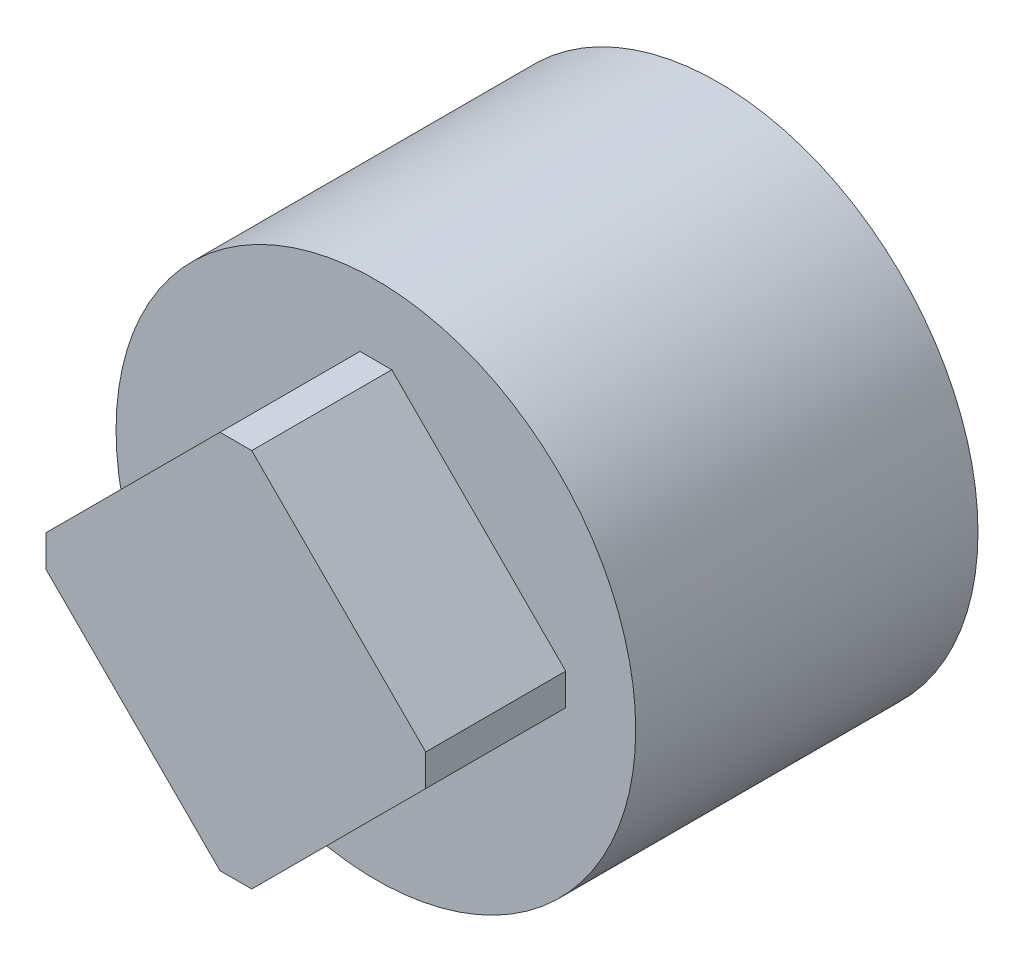
ISO-10303-21;
HEADER;
FILE_DESCRIPTION(('STEP AP214'),'2;1');
FILE_NAME('part.step','',(''),(''),'','','');
FILE_SCHEMA(('AUTOMOTIVE_DESIGN { 1 0 10303 214 1 1 1 1 }'));
ENDSEC;
DATA;
#1=APPLICATION_CONTEXT('core data for automotive mechanical design processes');
#2=APPLICATION_PROTOCOL_DEFINITION('international standard','automotive_design',2000,#1);
#3=PRODUCT_CONTEXT('',#1,'mechanical');
#4=PRODUCT('Part','Part','',(#3));
#5=PRODUCT_RELATED_PRODUCT_CATEGORY('part','',(#4));
#6=PRODUCT_DEFINITION_FORMATION('','',#4);
#7=PRODUCT_DEFINITION_CONTEXT('part definition',#1,'design');
#8=PRODUCT_DEFINITION('design','',#6,#7);
#9=PRODUCT_DEFINITION_SHAPE('','',#8);
#10=(LENGTH_UNIT() NAMED_UNIT(*) SI_UNIT(.MILLI.,.METRE.));
#11=(NAMED_UNIT(*) PLANE_ANGLE_UNIT() SI_UNIT($,.RADIAN.));
#12=(NAMED_UNIT(*) SI_UNIT($,.STERADIAN.) SOLID_ANGLE_UNIT());
#13=UNCERTAINTY_MEASURE_WITH_UNIT(LENGTH_MEASURE(1.E-05),#10,'distance_accuracy_value','');
#14=(GEOMETRIC_REPRESENTATION_CONTEXT(3) GLOBAL_UNCERTAINTY_ASSIGNED_CONTEXT((#13)) GLOBAL_UNIT_ASSIGNED_CONTEXT((#10,
#11,#12)) REPRESENTATION_CONTEXT('',''));
#15=CARTESIAN_POINT('',(0.,0.,0.));
#16=DIRECTION('',(0.,0.,1.));
#17=DIRECTION('',(1.,0.,0.));
#18=AXIS2_PLACEMENT_3D('',#15,#16,#17);
#19=CARTESIAN_POINT('',(0.,0.,1.));
#20=DIRECTION('',(0.,0.,1.));
#21=DIRECTION('',(1.,0.,0.));
#22=AXIS2_PLACEMENT_3D('',#19,#20,#21);
#23=PLANE('',#22);
#24=CARTESIAN_POINT('',(0.,0.,1.));
#25=DIRECTION('',(0.,0.,1.));
#26=DIRECTION('',(1.,0.,0.));
#27=AXIS2_PLACEMENT_3D('',#24,#25,#26);
#28=CIRCLE('',#27,10.2);
#29=CARTESIAN_POINT('',(10.2,0.,1.));
#30=VERTEX_POINT('',#29);
#31=EDGE_CURVE('E486',#30,#30,#28,.T.);
#32=ORIENTED_EDGE('',*,*,#31,.T.);
#33=EDGE_LOOP('',(#32));
#34=FACE_BOUND('',#33,.T.);
#35=CARTESIAN_POINT('',(0.,0.,1.));
#36=DIRECTION('',(0.,0.,1.));
#37=DIRECTION('',(1.,0.,0.));
#38=AXIS2_PLACEMENT_3D('',#35,#36,#37);
#39=CIRCLE('',#38,16.7);
#40=CARTESIAN_POINT('',(16.7,0.,1.));
#41=VERTEX_POINT('',#40);
#42=EDGE_CURVE('E259',#41,#41,#39,.T.);
#43=ORIENTED_EDGE('',*,*,#42,.F.);
#44=EDGE_LOOP('',(#43));
#45=FACE_BOUND('',#44,.T.);
#46=ADVANCED_FACE('F39',(#34,#45),#23,.F.);
#47=CARTESIAN_POINT('',(0.,0.,23.));
#48=DIRECTION('',(0.,0.,-1.));
#49=DIRECTION('',(-1.,0.,0.));
#50=AXIS2_PLACEMENT_3D('',#47,#48,#49);
#51=CYLINDRICAL_SURFACE('',#50,16.7);
#52=CARTESIAN_POINT('',(0.,0.,23.));
#53=DIRECTION('',(0.,0.,1.));
#54=DIRECTION('',(1.,0.,0.));
#55=AXIS2_PLACEMENT_3D('',#52,#53,#54);
#56=CIRCLE('',#55,16.7);
#57=CARTESIAN_POINT('',(16.7,0.,23.));
#58=VERTEX_POINT('',#57);
#59=EDGE_CURVE('E50',#58,#58,#56,.T.);
#60=ORIENTED_EDGE('',*,*,#59,.F.);
#61=EDGE_LOOP('',(#60));
#62=FACE_BOUND('',#61,.T.);
#63=ORIENTED_EDGE('',*,*,#42,.T.);
#64=EDGE_LOOP('',(#63));
#65=FACE_BOUND('',#64,.T.);
#66=ADVANCED_FACE('F41',(#62,#65),#51,.T.);
#67=CARTESIAN_POINT('',(0.,0.,23.));
#68=DIRECTION('',(0.,0.,1.));
#69=DIRECTION('',(1.,0.,0.));
#70=AXIS2_PLACEMENT_3D('',#67,#68,#69);
#71=PLANE('',#70);
#72=DIRECTION('',(-0.707106781186548,0.707106781186548,0.));
#73=VECTOR('',#72,1.);
#74=CARTESIAN_POINT('',(12.2028968081884,1.02,23.));
#75=LINE('',#74,#73);
#76=CARTESIAN_POINT('',(12.2028968081884,1.02,23.));
#77=VERTEX_POINT('',#76);
#78=CARTESIAN_POINT('',(1.02,12.2028968081884,23.));
#79=VERTEX_POINT('',#78);
#80=EDGE_CURVE('E62',#77,#79,#75,.T.);
#81=ORIENTED_EDGE('',*,*,#80,.F.);
#82=DIRECTION('',(0.,1.,0.));
#83=VECTOR('',#82,1.);
#84=CARTESIAN_POINT('',(12.2028968081884,-1.02,23.));
#85=LINE('',#84,#83);
#86=CARTESIAN_POINT('',(12.2028968081884,-1.02,23.));
#87=VERTEX_POINT('',#86);
#88=EDGE_CURVE('E197',#87,#77,#85,.T.);
#89=ORIENTED_EDGE('',*,*,#88,.F.);
#90=DIRECTION('',(0.707106781186548,0.707106781186548,0.));
#91=VECTOR('',#90,1.);
#92=CARTESIAN_POINT('',(1.02,-12.2028968081884,23.));
#93=LINE('',#92,#91);
#94=CARTESIAN_POINT('',(1.02,-12.2028968081884,23.));
#95=VERTEX_POINT('',#94);
#96=EDGE_CURVE('E229',#95,#87,#93,.T.);
#97=ORIENTED_EDGE('',*,*,#96,.F.);
#98=DIRECTION('',(1.,0.,0.));
#99=VECTOR('',#98,1.);
#100=CARTESIAN_POINT('',(-1.02,-12.2028968081884,23.));
#101=LINE('',#100,#99);
#102=CARTESIAN_POINT('',(-1.02,-12.2028968081884,23.));
#103=VERTEX_POINT('',#102);
#104=EDGE_CURVE('E227',#103,#95,#101,.T.);
#105=ORIENTED_EDGE('',*,*,#104,.F.);
#106=DIRECTION('',(0.707106781186548,-0.707106781186548,0.));
#107=VECTOR('',#106,1.);
#108=CARTESIAN_POINT('',(-12.2028968081884,-1.02,23.));
#109=LINE('',#108,#107);
#110=CARTESIAN_POINT('',(-12.2028968081884,-1.02,23.));
#111=VERTEX_POINT('',#110);
#112=EDGE_CURVE('E225',#111,#103,#109,.T.);
#113=ORIENTED_EDGE('',*,*,#112,.F.);
#114=DIRECTION('',(0.,-1.,0.));
#115=VECTOR('',#114,1.);
#116=CARTESIAN_POINT('',(-12.2028968081884,1.02,23.));
#117=LINE('',#116,#115);
#118=CARTESIAN_POINT('',(-12.2028968081884,1.02,23.));
#119=VERTEX_POINT('',#118);
#120=EDGE_CURVE('E223',#119,#111,#117,.T.);
#121=ORIENTED_EDGE('',*,*,#120,.F.);
#122=DIRECTION('',(-0.707106781186548,-0.707106781186548,0.));
#123=VECTOR('',#122,1.);
#124=CARTESIAN_POINT('',(-1.02,12.2028968081884,23.));
#125=LINE('',#124,#123);
#126=CARTESIAN_POINT('',(-1.02,12.2028968081884,23.));
#127=VERTEX_POINT('',#126);
#128=EDGE_CURVE('E216',#127,#119,#125,.T.);
#129=ORIENTED_EDGE('',*,*,#128,.F.);
#130=DIRECTION('',(-1.,0.,0.));
#131=VECTOR('',#130,1.);
#132=CARTESIAN_POINT('',(1.02,12.2028968081884,23.));
#133=LINE('',#132,#131);
#134=EDGE_CURVE('E213',#79,#127,#133,.T.);
#135=ORIENTED_EDGE('',*,*,#134,.F.);
#136=EDGE_LOOP('',(#81,#89,#97,#105,#113,#121,#129,#135));
#137=FACE_BOUND('',#136,.T.);
#138=ORIENTED_EDGE('',*,*,#59,.T.);
#139=EDGE_LOOP('',(#138));
#140=FACE_BOUND('',#139,.T.);
#141=ADVANCED_FACE('F266',(#137,#140),#71,.T.);
#142=CARTESIAN_POINT('',(12.2028968081884,1.02,32.));
#143=DIRECTION('',(-0.707106781186547,-0.707106781186547,0.));
#144=DIRECTION('',(0.707106781186548,-0.707106781186548,0.));
#145=AXIS2_PLACEMENT_3D('',#142,#143,#144);
#146=PLANE('',#145);
#147=ORIENTED_EDGE('',*,*,#80,.T.);
#148=DIRECTION('',(0.,0.,-1.));
#149=VECTOR('',#148,1.);
#150=CARTESIAN_POINT('',(1.02,12.2028968081884,32.));
#151=LINE('',#150,#149);
#152=CARTESIAN_POINT('',(1.02,12.2028968081884,32.));
#153=VERTEX_POINT('',#152);
#154=EDGE_CURVE('E251',#153,#79,#151,.T.);
#155=ORIENTED_EDGE('',*,*,#154,.F.);
#156=DIRECTION('',(-0.707106781186548,0.707106781186548,0.));
#157=VECTOR('',#156,1.);
#158=CARTESIAN_POINT('',(12.2028968081884,1.02,32.));
#159=LINE('',#158,#157);
#160=CARTESIAN_POINT('',(12.2028968081884,1.02,32.));
#161=VERTEX_POINT('',#160);
#162=EDGE_CURVE('E193',#161,#153,#159,.T.);
#163=ORIENTED_EDGE('',*,*,#162,.F.);
#164=DIRECTION('',(0.,0.,-1.));
#165=VECTOR('',#164,1.);
#166=CARTESIAN_POINT('',(12.2028968081884,1.02,32.));
#167=LINE('',#166,#165);
#168=EDGE_CURVE('E215',#161,#77,#167,.T.);
#169=ORIENTED_EDGE('',*,*,#168,.T.);
#170=EDGE_LOOP('',(#147,#155,#163,#169));
#171=FACE_BOUND('',#170,.T.);
#172=ADVANCED_FACE('F277',(#171),#146,.F.);
#173=CARTESIAN_POINT('',(1.02,12.2028968081884,32.));
#174=DIRECTION('',(0.,-1.,0.));
#175=DIRECTION('',(0.,0.,-1.));
#176=AXIS2_PLACEMENT_3D('',#173,#174,#175);
#177=PLANE('',#176);
#178=ORIENTED_EDGE('',*,*,#134,.T.);
#179=DIRECTION('',(0.,0.,-1.));
#180=VECTOR('',#179,1.);
#181=CARTESIAN_POINT('',(-1.02,12.2028968081884,32.));
#182=LINE('',#181,#180);
#183=CARTESIAN_POINT('',(-1.02,12.2028968081884,32.));
#184=VERTEX_POINT('',#183);
#185=EDGE_CURVE('E252',#184,#127,#182,.T.);
#186=ORIENTED_EDGE('',*,*,#185,.F.);
#187=DIRECTION('',(-1.,0.,0.));
#188=VECTOR('',#187,1.);
#189=CARTESIAN_POINT('',(1.02,12.2028968081884,32.));
#190=LINE('',#189,#188);
#191=EDGE_CURVE('E196',#153,#184,#190,.T.);
#192=ORIENTED_EDGE('',*,*,#191,.F.);
#193=ORIENTED_EDGE('',*,*,#154,.T.);
#194=EDGE_LOOP('',(#178,#186,#192,#193));
#195=FACE_BOUND('',#194,.T.);
#196=ADVANCED_FACE('F276',(#195),#177,.F.);
#197=CARTESIAN_POINT('',(-1.02,12.2028968081884,32.));
#198=DIRECTION('',(0.707106781186547,-0.707106781186547,0.));
#199=DIRECTION('',(0.707106781186548,0.707106781186548,0.));
#200=AXIS2_PLACEMENT_3D('',#197,#198,#199);
#201=PLANE('',#200);
#202=ORIENTED_EDGE('',*,*,#128,.T.);
#203=DIRECTION('',(0.,0.,-1.));
#204=VECTOR('',#203,1.);
#205=CARTESIAN_POINT('',(-12.2028968081884,1.02,32.));
#206=LINE('',#205,#204);
#207=CARTESIAN_POINT('',(-12.2028968081884,1.02,32.));
#208=VERTEX_POINT('',#207);
#209=EDGE_CURVE('E247',#208,#119,#206,.T.);
#210=ORIENTED_EDGE('',*,*,#209,.F.);
#211=DIRECTION('',(-0.707106781186548,-0.707106781186548,0.));
#212=VECTOR('',#211,1.);
#213=CARTESIAN_POINT('',(-1.02,12.2028968081884,32.));
#214=LINE('',#213,#212);
#215=EDGE_CURVE('E203',#184,#208,#214,.T.);
#216=ORIENTED_EDGE('',*,*,#215,.F.);
#217=ORIENTED_EDGE('',*,*,#185,.T.);
#218=EDGE_LOOP('',(#202,#210,#216,#217));
#219=FACE_BOUND('',#218,.T.);
#220=ADVANCED_FACE('F281',(#219),#201,.F.);
#221=CARTESIAN_POINT('',(-12.2028968081884,1.02,32.));
#222=DIRECTION('',(1.,0.,0.));
#223=DIRECTION('',(0.,0.,-1.));
#224=AXIS2_PLACEMENT_3D('',#221,#222,#223);
#225=PLANE('',#224);
#226=ORIENTED_EDGE('',*,*,#120,.T.);
#227=DIRECTION('',(0.,0.,-1.));
#228=VECTOR('',#227,1.);
#229=CARTESIAN_POINT('',(-12.2028968081884,-1.02,32.));
#230=LINE('',#229,#228);
#231=CARTESIAN_POINT('',(-12.2028968081884,-1.02,32.));
#232=VERTEX_POINT('',#231);
#233=EDGE_CURVE('E244',#232,#111,#230,.T.);
#234=ORIENTED_EDGE('',*,*,#233,.F.);
#235=DIRECTION('',(0.,-1.,0.));
#236=VECTOR('',#235,1.);
#237=CARTESIAN_POINT('',(-12.2028968081884,1.02,32.));
#238=LINE('',#237,#236);
#239=EDGE_CURVE('E202',#208,#232,#238,.T.);
#240=ORIENTED_EDGE('',*,*,#239,.F.);
#241=ORIENTED_EDGE('',*,*,#209,.T.);
#242=EDGE_LOOP('',(#226,#234,#240,#241));
#243=FACE_BOUND('',#242,.T.);
#244=ADVANCED_FACE('F289',(#243),#225,.F.);
#245=CARTESIAN_POINT('',(-12.2028968081884,-1.02,32.));
#246=DIRECTION('',(0.707106781186547,0.707106781186547,0.));
#247=DIRECTION('',(-0.707106781186548,0.707106781186548,0.));
#248=AXIS2_PLACEMENT_3D('',#245,#246,#247);
#249=PLANE('',#248);
#250=ORIENTED_EDGE('',*,*,#112,.T.);
#251=DIRECTION('',(0.,0.,-1.));
#252=VECTOR('',#251,1.);
#253=CARTESIAN_POINT('',(-1.02,-12.2028968081884,32.));
#254=LINE('',#253,#252);
#255=CARTESIAN_POINT('',(-1.02,-12.2028968081884,32.));
#256=VERTEX_POINT('',#255);
#257=EDGE_CURVE('E245',#256,#103,#254,.T.);
#258=ORIENTED_EDGE('',*,*,#257,.F.);
#259=DIRECTION('',(0.707106781186548,-0.707106781186548,0.));
#260=VECTOR('',#259,1.);
#261=CARTESIAN_POINT('',(-12.2028968081884,-1.02,32.));
#262=LINE('',#261,#260);
#263=EDGE_CURVE('E201',#232,#256,#262,.T.);
#264=ORIENTED_EDGE('',*,*,#263,.F.);
#265=ORIENTED_EDGE('',*,*,#233,.T.);
#266=EDGE_LOOP('',(#250,#258,#264,#265));
#267=FACE_BOUND('',#266,.T.);
#268=ADVANCED_FACE('F293',(#267),#249,.F.);
#269=CARTESIAN_POINT('',(-1.02,-12.2028968081884,32.));
#270=DIRECTION('',(0.,1.,0.));
#271=DIRECTION('',(0.,0.,1.));
#272=AXIS2_PLACEMENT_3D('',#269,#270,#271);
#273=PLANE('',#272);
#274=ORIENTED_EDGE('',*,*,#104,.T.);
#275=DIRECTION('',(0.,0.,-1.));
#276=VECTOR('',#275,1.);
#277=CARTESIAN_POINT('',(1.02,-12.2028968081884,32.));
#278=LINE('',#277,#276);
#279=CARTESIAN_POINT('',(1.02,-12.2028968081884,32.));
#280=VERTEX_POINT('',#279);
#281=EDGE_CURVE('E237',#280,#95,#278,.T.);
#282=ORIENTED_EDGE('',*,*,#281,.F.);
#283=DIRECTION('',(1.,0.,0.));
#284=VECTOR('',#283,1.);
#285=CARTESIAN_POINT('',(-1.02,-12.2028968081884,32.));
#286=LINE('',#285,#284);
#287=EDGE_CURVE('E210',#256,#280,#286,.T.);
#288=ORIENTED_EDGE('',*,*,#287,.F.);
#289=ORIENTED_EDGE('',*,*,#257,.T.);
#290=EDGE_LOOP('',(#274,#282,#288,#289));
#291=FACE_BOUND('',#290,.T.);
#292=ADVANCED_FACE('F294',(#291),#273,.F.);
#293=CARTESIAN_POINT('',(1.02,-12.2028968081884,32.));
#294=DIRECTION('',(-0.707106781186547,0.707106781186547,0.));
#295=DIRECTION('',(-0.707106781186548,-0.707106781186548,0.));
#296=AXIS2_PLACEMENT_3D('',#293,#294,#295);
#297=PLANE('',#296);
#298=ORIENTED_EDGE('',*,*,#96,.T.);
#299=DIRECTION('',(0.,0.,-1.));
#300=VECTOR('',#299,1.);
#301=CARTESIAN_POINT('',(12.2028968081884,-1.02,32.));
#302=LINE('',#301,#300);
#303=CARTESIAN_POINT('',(12.2028968081884,-1.02,32.));
#304=VERTEX_POINT('',#303);
#305=EDGE_CURVE('E236',#304,#87,#302,.T.);
#306=ORIENTED_EDGE('',*,*,#305,.F.);
#307=DIRECTION('',(0.707106781186548,0.707106781186548,0.));
#308=VECTOR('',#307,1.);
#309=CARTESIAN_POINT('',(1.02,-12.2028968081884,32.));
#310=LINE('',#309,#308);
#311=EDGE_CURVE('E209',#280,#304,#310,.T.);
#312=ORIENTED_EDGE('',*,*,#311,.F.);
#313=ORIENTED_EDGE('',*,*,#281,.T.);
#314=EDGE_LOOP('',(#298,#306,#312,#313));
#315=FACE_BOUND('',#314,.T.);
#316=ADVANCED_FACE('F299',(#315),#297,.F.);
#317=CARTESIAN_POINT('',(12.2028968081884,-1.02,32.));
#318=DIRECTION('',(-1.,0.,0.));
#319=DIRECTION('',(0.,0.,1.));
#320=AXIS2_PLACEMENT_3D('',#317,#318,#319);
#321=PLANE('',#320);
#322=ORIENTED_EDGE('',*,*,#88,.T.);
#323=ORIENTED_EDGE('',*,*,#168,.F.);
#324=DIRECTION('',(0.,1.,0.));
#325=VECTOR('',#324,1.);
#326=CARTESIAN_POINT('',(12.2028968081884,-1.02,32.));
#327=LINE('',#326,#325);
#328=EDGE_CURVE('E212',#304,#161,#327,.T.);
#329=ORIENTED_EDGE('',*,*,#328,.F.);
#330=ORIENTED_EDGE('',*,*,#305,.T.);
#331=EDGE_LOOP('',(#322,#323,#329,#330));
#332=FACE_BOUND('',#331,.T.);
#333=ADVANCED_FACE('F303',(#332),#321,.F.);
#334=CARTESIAN_POINT('',(0.,0.,32.));
#335=DIRECTION('',(0.,0.,1.));
#336=DIRECTION('',(1.,0.,0.));
#337=AXIS2_PLACEMENT_3D('',#334,#335,#336);
#338=PLANE('',#337);
#339=ORIENTED_EDGE('',*,*,#162,.T.);
#340=ORIENTED_EDGE('',*,*,#191,.T.);
#341=ORIENTED_EDGE('',*,*,#215,.T.);
#342=ORIENTED_EDGE('',*,*,#239,.T.);
#343=ORIENTED_EDGE('',*,*,#263,.T.);
#344=ORIENTED_EDGE('',*,*,#287,.T.);
#345=ORIENTED_EDGE('',*,*,#311,.T.);
#346=ORIENTED_EDGE('',*,*,#328,.T.);
#347=EDGE_LOOP('',(#339,#340,#341,#342,#343,#344,#345,#346));
#348=FACE_BOUND('',#347,.T.);
#349=ADVANCED_FACE('F310',(#348),#338,.T.);
#350=CARTESIAN_POINT('',(0.,0.,2.1));
#351=DIRECTION('',(0.,0.,-1.));
#352=DIRECTION('',(-1.,0.,0.));
#353=AXIS2_PLACEMENT_3D('',#350,#351,#352);
#354=CYLINDRICAL_SURFACE('',#353,10.2);
#355=CARTESIAN_POINT('',(0.,0.,2.1));
#356=DIRECTION('',(0.,0.,1.));
#357=DIRECTION('',(1.,0.,0.));
#358=AXIS2_PLACEMENT_3D('',#355,#356,#357);
#359=CIRCLE('',#358,10.2);
#360=CARTESIAN_POINT('',(10.2,0.,2.1));
#361=VERTEX_POINT('',#360);
#362=EDGE_CURVE('E488',#361,#361,#359,.T.);
#363=ORIENTED_EDGE('',*,*,#362,.T.);
#364=EDGE_LOOP('',(#363));
#365=FACE_BOUND('',#364,.T.);
#366=ORIENTED_EDGE('',*,*,#31,.F.);
#367=EDGE_LOOP('',(#366));
#368=FACE_BOUND('',#367,.T.);
#369=ADVANCED_FACE('F311',(#365,#368),#354,.F.);
#370=CARTESIAN_POINT('',(0.,0.,2.1));
#371=DIRECTION('',(0.,0.,1.));
#372=DIRECTION('',(1.,0.,0.));
#373=AXIS2_PLACEMENT_3D('',#370,#371,#372);
#374=PLANE('',#373);
#375=DIRECTION('',(-0.707106781186548,0.707106781186548,0.));
#376=VECTOR('',#375,1.);
#377=CARTESIAN_POINT('',(6.89959594928933,1.02,2.1));
#378=LINE('',#377,#376);
#379=CARTESIAN_POINT('',(6.89959594928933,1.02,2.1));
#380=VERTEX_POINT('',#379);
#381=CARTESIAN_POINT('',(1.02,6.89959594928933,2.1));
#382=VERTEX_POINT('',#381);
#383=EDGE_CURVE('E153',#380,#382,#378,.T.);
#384=ORIENTED_EDGE('',*,*,#383,.T.);
#385=DIRECTION('',(-1.,0.,0.));
#386=VECTOR('',#385,1.);
#387=CARTESIAN_POINT('',(1.02,6.89959594928933,2.1));
#388=LINE('',#387,#386);
#389=CARTESIAN_POINT('',(-1.02,6.89959594928933,2.1));
#390=VERTEX_POINT('',#389);
#391=EDGE_CURVE('E170',#382,#390,#388,.T.);
#392=ORIENTED_EDGE('',*,*,#391,.T.);
#393=DIRECTION('',(-0.707106781186548,-0.707106781186548,0.));
#394=VECTOR('',#393,1.);
#395=CARTESIAN_POINT('',(-1.02,6.89959594928933,2.1));
#396=LINE('',#395,#394);
#397=CARTESIAN_POINT('',(-6.89959594928933,1.02,2.1));
#398=VERTEX_POINT('',#397);
#399=EDGE_CURVE('E497',#390,#398,#396,.T.);
#400=ORIENTED_EDGE('',*,*,#399,.T.);
#401=DIRECTION('',(0.,-1.,0.));
#402=VECTOR('',#401,1.);
#403=CARTESIAN_POINT('',(-6.89959594928933,1.02,2.1));
#404=LINE('',#403,#402);
#405=CARTESIAN_POINT('',(-6.89959594928933,-1.02,2.1));
#406=VERTEX_POINT('',#405);
#407=EDGE_CURVE('E500',#398,#406,#404,.T.);
#408=ORIENTED_EDGE('',*,*,#407,.T.);
#409=DIRECTION('',(0.707106781186548,-0.707106781186548,0.));
#410=VECTOR('',#409,1.);
#411=CARTESIAN_POINT('',(-6.89959594928933,-1.02,2.1));
#412=LINE('',#411,#410);
#413=CARTESIAN_POINT('',(-1.02,-6.89959594928933,2.1));
#414=VERTEX_POINT('',#413);
#415=EDGE_CURVE('E492',#406,#414,#412,.T.);
#416=ORIENTED_EDGE('',*,*,#415,.T.);
#417=DIRECTION('',(1.,0.,0.));
#418=VECTOR('',#417,1.);
#419=CARTESIAN_POINT('',(-1.02,-6.89959594928933,2.1));
#420=LINE('',#419,#418);
#421=CARTESIAN_POINT('',(1.02,-6.89959594928933,2.1));
#422=VERTEX_POINT('',#421);
#423=EDGE_CURVE('E491',#414,#422,#420,.T.);
#424=ORIENTED_EDGE('',*,*,#423,.T.);
#425=DIRECTION('',(0.707106781186548,0.707106781186548,0.));
#426=VECTOR('',#425,1.);
#427=CARTESIAN_POINT('',(1.02,-6.89959594928933,2.1));
#428=LINE('',#427,#426);
#429=CARTESIAN_POINT('',(6.89959594928933,-1.02,2.1));
#430=VERTEX_POINT('',#429);
#431=EDGE_CURVE('E52',#422,#430,#428,.T.);
#432=ORIENTED_EDGE('',*,*,#431,.T.);
#433=DIRECTION('',(0.,1.,0.));
#434=VECTOR('',#433,1.);
#435=CARTESIAN_POINT('',(6.89959594928933,-1.02,2.1));
#436=LINE('',#435,#434);
#437=EDGE_CURVE('E11',#430,#380,#436,.T.);
#438=ORIENTED_EDGE('',*,*,#437,.T.);
#439=EDGE_LOOP('',(#384,#392,#400,#408,#416,#424,#432,#438));
#440=FACE_BOUND('',#439,.T.);
#441=ORIENTED_EDGE('',*,*,#362,.F.);
#442=EDGE_LOOP('',(#441));
#443=FACE_BOUND('',#442,.T.);
#444=ADVANCED_FACE('F146',(#440,#443),#374,.F.);
#445=CARTESIAN_POINT('',(0.,0.,20.1));
#446=DIRECTION('',(0.,0.,1.));
#447=DIRECTION('',(1.,0.,0.));
#448=AXIS2_PLACEMENT_3D('',#445,#446,#447);
#449=PLANE('',#448);
#450=DIRECTION('',(-0.707106781186548,0.707106781186548,0.));
#451=VECTOR('',#450,1.);
#452=CARTESIAN_POINT('',(6.89959594928933,1.02,20.1));
#453=LINE('',#452,#451);
#454=CARTESIAN_POINT('',(6.89959594928933,1.02,20.1));
#455=VERTEX_POINT('',#454);
#456=CARTESIAN_POINT('',(1.02,6.89959594928933,20.1));
#457=VERTEX_POINT('',#456);
#458=EDGE_CURVE('E168',#455,#457,#453,.T.);
#459=ORIENTED_EDGE('',*,*,#458,.F.);
#460=DIRECTION('',(0.,1.,0.));
#461=VECTOR('',#460,1.);
#462=CARTESIAN_POINT('',(6.89959594928933,-1.02,20.1));
#463=LINE('',#462,#461);
#464=CARTESIAN_POINT('',(6.89959594928933,-1.02,20.1));
#465=VERTEX_POINT('',#464);
#466=EDGE_CURVE('E171',#465,#455,#463,.T.);
#467=ORIENTED_EDGE('',*,*,#466,.F.);
#468=DIRECTION('',(0.707106781186548,0.707106781186548,0.));
#469=VECTOR('',#468,1.);
#470=CARTESIAN_POINT('',(1.02,-6.89959594928933,20.1));
#471=LINE('',#470,#469);
#472=CARTESIAN_POINT('',(1.02,-6.89959594928933,20.1));
#473=VERTEX_POINT('',#472);
#474=EDGE_CURVE('E176',#473,#465,#471,.T.);
#475=ORIENTED_EDGE('',*,*,#474,.F.);
#476=DIRECTION('',(1.,0.,0.));
#477=VECTOR('',#476,1.);
#478=CARTESIAN_POINT('',(-1.02,-6.89959594928933,20.1));
#479=LINE('',#478,#477);
#480=CARTESIAN_POINT('',(-1.02,-6.89959594928933,20.1));
#481=VERTEX_POINT('',#480);
#482=EDGE_CURVE('E512',#481,#473,#479,.T.);
#483=ORIENTED_EDGE('',*,*,#482,.F.);
#484=DIRECTION('',(0.707106781186548,-0.707106781186548,0.));
#485=VECTOR('',#484,1.);
#486=CARTESIAN_POINT('',(-6.89959594928933,-1.02,20.1));
#487=LINE('',#486,#485);
#488=CARTESIAN_POINT('',(-6.89959594928933,-1.02,20.1));
#489=VERTEX_POINT('',#488);
#490=EDGE_CURVE('E508',#489,#481,#487,.T.);
#491=ORIENTED_EDGE('',*,*,#490,.F.);
#492=DIRECTION('',(0.,-1.,0.));
#493=VECTOR('',#492,1.);
#494=CARTESIAN_POINT('',(-6.89959594928933,1.02,20.1));
#495=LINE('',#494,#493);
#496=CARTESIAN_POINT('',(-6.89959594928933,1.02,20.1));
#497=VERTEX_POINT('',#496);
#498=EDGE_CURVE('E510',#497,#489,#495,.T.);
#499=ORIENTED_EDGE('',*,*,#498,.F.);
#500=DIRECTION('',(-0.707106781186548,-0.707106781186548,0.));
#501=VECTOR('',#500,1.);
#502=CARTESIAN_POINT('',(-1.02,6.89959594928933,20.1));
#503=LINE('',#502,#501);
#504=CARTESIAN_POINT('',(-1.02,6.89959594928933,20.1));
#505=VERTEX_POINT('',#504);
#506=EDGE_CURVE('E504',#505,#497,#503,.T.);
#507=ORIENTED_EDGE('',*,*,#506,.F.);
#508=DIRECTION('',(-1.,0.,0.));
#509=VECTOR('',#508,1.);
#510=CARTESIAN_POINT('',(1.02,6.89959594928933,20.1));
#511=LINE('',#510,#509);
#512=EDGE_CURVE('E503',#457,#505,#511,.T.);
#513=ORIENTED_EDGE('',*,*,#512,.F.);
#514=EDGE_LOOP('',(#459,#467,#475,#483,#491,#499,#507,#513));
#515=FACE_BOUND('',#514,.T.);
#516=ADVANCED_FACE('F342',(#515),#449,.F.);
#517=CARTESIAN_POINT('',(6.89959594928933,-1.02,20.1));
#518=DIRECTION('',(-1.,0.,0.));
#519=DIRECTION('',(0.,0.,1.));
#520=AXIS2_PLACEMENT_3D('',#517,#518,#519);
#521=PLANE('',#520);
#522=ORIENTED_EDGE('',*,*,#437,.F.);
#523=DIRECTION('',(0.,0.,-1.));
#524=VECTOR('',#523,1.);
#525=CARTESIAN_POINT('',(6.89959594928933,-1.02,20.1));
#526=LINE('',#525,#524);
#527=EDGE_CURVE('E175',#465,#430,#526,.T.);
#528=ORIENTED_EDGE('',*,*,#527,.F.);
#529=ORIENTED_EDGE('',*,*,#466,.T.);
#530=DIRECTION('',(0.,0.,-1.));
#531=VECTOR('',#530,1.);
#532=CARTESIAN_POINT('',(6.89959594928933,1.02,20.1));
#533=LINE('',#532,#531);
#534=EDGE_CURVE('E162',#455,#380,#533,.T.);
#535=ORIENTED_EDGE('',*,*,#534,.T.);
#536=EDGE_LOOP('',(#522,#528,#529,#535));
#537=FACE_BOUND('',#536,.T.);
#538=ADVANCED_FACE('F169',(#537),#521,.T.);
#539=CARTESIAN_POINT('',(1.02,-6.89959594928933,20.1));
#540=DIRECTION('',(-0.707106781186548,0.707106781186548,0.));
#541=DIRECTION('',(-0.707106781186548,-0.707106781186548,0.));
#542=AXIS2_PLACEMENT_3D('',#539,#540,#541);
#543=PLANE('',#542);
#544=ORIENTED_EDGE('',*,*,#431,.F.);
#545=DIRECTION('',(0.,0.,-1.));
#546=VECTOR('',#545,1.);
#547=CARTESIAN_POINT('',(1.02,-6.89959594928933,20.1));
#548=LINE('',#547,#546);
#549=EDGE_CURVE('E172',#473,#422,#548,.T.);
#550=ORIENTED_EDGE('',*,*,#549,.F.);
#551=ORIENTED_EDGE('',*,*,#474,.T.);
#552=ORIENTED_EDGE('',*,*,#527,.T.);
#553=EDGE_LOOP('',(#544,#550,#551,#552));
#554=FACE_BOUND('',#553,.T.);
#555=ADVANCED_FACE('F335',(#554),#543,.T.);
#556=CARTESIAN_POINT('',(-1.02,-6.89959594928933,20.1));
#557=DIRECTION('',(0.,1.,0.));
#558=DIRECTION('',(0.,0.,1.));
#559=AXIS2_PLACEMENT_3D('',#556,#557,#558);
#560=PLANE('',#559);
#561=ORIENTED_EDGE('',*,*,#423,.F.);
#562=DIRECTION('',(0.,0.,-1.));
#563=VECTOR('',#562,1.);
#564=CARTESIAN_POINT('',(-1.02,-6.89959594928933,20.1));
#565=LINE('',#564,#563);
#566=EDGE_CURVE('E185',#481,#414,#565,.T.);
#567=ORIENTED_EDGE('',*,*,#566,.F.);
#568=ORIENTED_EDGE('',*,*,#482,.T.);
#569=ORIENTED_EDGE('',*,*,#549,.T.);
#570=EDGE_LOOP('',(#561,#567,#568,#569));
#571=FACE_BOUND('',#570,.T.);
#572=ADVANCED_FACE('F329',(#571),#560,.T.);
#573=CARTESIAN_POINT('',(-6.89959594928933,-1.02,20.1));
#574=DIRECTION('',(0.707106781186548,0.707106781186548,0.));
#575=DIRECTION('',(-0.707106781186548,0.707106781186548,0.));
#576=AXIS2_PLACEMENT_3D('',#573,#574,#575);
#577=PLANE('',#576);
#578=ORIENTED_EDGE('',*,*,#415,.F.);
#579=DIRECTION('',(0.,0.,-1.));
#580=VECTOR('',#579,1.);
#581=CARTESIAN_POINT('',(-6.89959594928933,-1.02,20.1));
#582=LINE('',#581,#580);
#583=EDGE_CURVE('E184',#489,#406,#582,.T.);
#584=ORIENTED_EDGE('',*,*,#583,.F.);
#585=ORIENTED_EDGE('',*,*,#490,.T.);
#586=ORIENTED_EDGE('',*,*,#566,.T.);
#587=EDGE_LOOP('',(#578,#584,#585,#586));
#588=FACE_BOUND('',#587,.T.);
#589=ADVANCED_FACE('F328',(#588),#577,.T.);
#590=CARTESIAN_POINT('',(-6.89959594928933,1.02,20.1));
#591=DIRECTION('',(1.,0.,0.));
#592=DIRECTION('',(0.,0.,-1.));
#593=AXIS2_PLACEMENT_3D('',#590,#591,#592);
#594=PLANE('',#593);
#595=ORIENTED_EDGE('',*,*,#407,.F.);
#596=DIRECTION('',(0.,0.,-1.));
#597=VECTOR('',#596,1.);
#598=CARTESIAN_POINT('',(-6.89959594928933,1.02,20.1));
#599=LINE('',#598,#597);
#600=EDGE_CURVE('E189',#497,#398,#599,.T.);
#601=ORIENTED_EDGE('',*,*,#600,.F.);
#602=ORIENTED_EDGE('',*,*,#498,.T.);
#603=ORIENTED_EDGE('',*,*,#583,.T.);
#604=EDGE_LOOP('',(#595,#601,#602,#603));
#605=FACE_BOUND('',#604,.T.);
#606=ADVANCED_FACE('F324',(#605),#594,.T.);
#607=CARTESIAN_POINT('',(-1.02,6.89959594928933,20.1));
#608=DIRECTION('',(0.707106781186548,-0.707106781186548,0.));
#609=DIRECTION('',(0.707106781186548,0.707106781186548,0.));
#610=AXIS2_PLACEMENT_3D('',#607,#608,#609);
#611=PLANE('',#610);
#612=ORIENTED_EDGE('',*,*,#399,.F.);
#613=DIRECTION('',(0.,0.,-1.));
#614=VECTOR('',#613,1.);
#615=CARTESIAN_POINT('',(-1.02,6.89959594928933,20.1));
#616=LINE('',#615,#614);
#617=EDGE_CURVE('E192',#505,#390,#616,.T.);
#618=ORIENTED_EDGE('',*,*,#617,.F.);
#619=ORIENTED_EDGE('',*,*,#506,.T.);
#620=ORIENTED_EDGE('',*,*,#600,.T.);
#621=EDGE_LOOP('',(#612,#618,#619,#620));
#622=FACE_BOUND('',#621,.T.);
#623=ADVANCED_FACE('F319',(#622),#611,.T.);
#624=CARTESIAN_POINT('',(1.02,6.89959594928933,20.1));
#625=DIRECTION('',(0.,-1.,0.));
#626=DIRECTION('',(0.,0.,-1.));
#627=AXIS2_PLACEMENT_3D('',#624,#625,#626);
#628=PLANE('',#627);
#629=ORIENTED_EDGE('',*,*,#391,.F.);
#630=DIRECTION('',(0.,0.,-1.));
#631=VECTOR('',#630,1.);
#632=CARTESIAN_POINT('',(1.02,6.89959594928933,20.1));
#633=LINE('',#632,#631);
#634=EDGE_CURVE('E164',#457,#382,#633,.T.);
#635=ORIENTED_EDGE('',*,*,#634,.F.);
#636=ORIENTED_EDGE('',*,*,#512,.T.);
#637=ORIENTED_EDGE('',*,*,#617,.T.);
#638=EDGE_LOOP('',(#629,#635,#636,#637));
#639=FACE_BOUND('',#638,.T.);
#640=ADVANCED_FACE('F314',(#639),#628,.T.);
#641=CARTESIAN_POINT('',(6.89959594928933,1.02,20.1));
#642=DIRECTION('',(-0.707106781186548,-0.707106781186548,0.));
#643=DIRECTION('',(0.707106781186548,-0.707106781186548,0.));
#644=AXIS2_PLACEMENT_3D('',#641,#642,#643);
#645=PLANE('',#644);
#646=ORIENTED_EDGE('',*,*,#383,.F.);
#647=ORIENTED_EDGE('',*,*,#534,.F.);
#648=ORIENTED_EDGE('',*,*,#458,.T.);
#649=ORIENTED_EDGE('',*,*,#634,.T.);
#650=EDGE_LOOP('',(#646,#647,#648,#649));
#651=FACE_BOUND('',#650,.T.);
#652=ADVANCED_FACE('F156',(#651),#645,.T.);
#653=CLOSED_SHELL('',(#46,#66,#141,#172,#196,#220,#244,#268,#292,#316,#333,#349,#369,#444,#516,
#538,#555,#572,#589,#606,#623,#640,#652));
#654=MANIFOLD_SOLID_BREP('B2',#653);
#655=ADVANCED_BREP_SHAPE_REPRESENTATION('',(#18,#654),#14);
#656=SHAPE_DEFINITION_REPRESENTATION(#9,#655);
ENDSEC;
END-ISO-10303-21;
